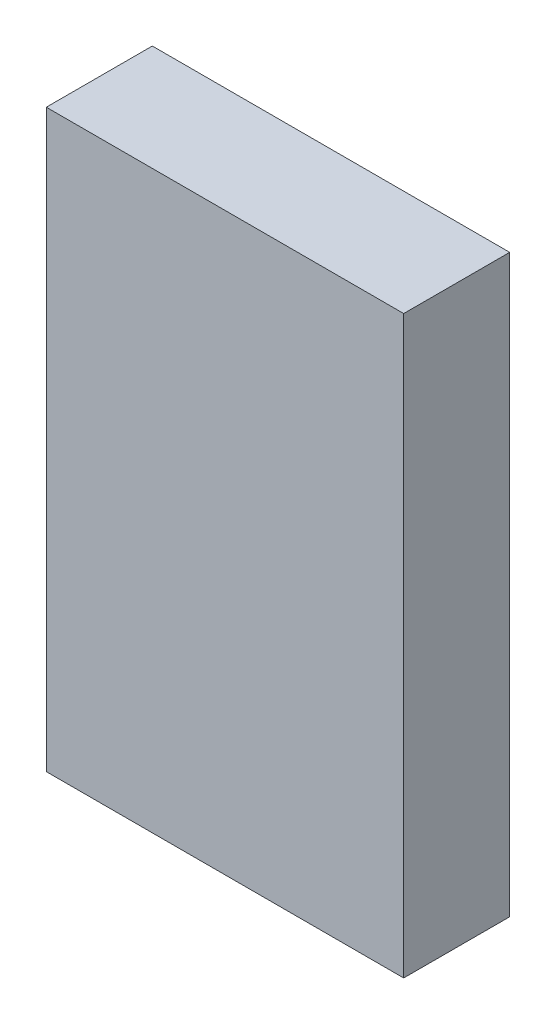
ISO-10303-21;
HEADER;
FILE_DESCRIPTION(('STEP AP214'),'2;1');
FILE_NAME('part.step','',(''),(''),'','','');
FILE_SCHEMA(('AUTOMOTIVE_DESIGN { 1 0 10303 214 1 1 1 1 }'));
ENDSEC;
DATA;
#1=APPLICATION_CONTEXT('core data for automotive mechanical design processes');
#2=APPLICATION_PROTOCOL_DEFINITION('international standard','automotive_design',2000,#1);
#3=PRODUCT_CONTEXT('',#1,'mechanical');
#4=PRODUCT('Part','Part','',(#3));
#5=PRODUCT_RELATED_PRODUCT_CATEGORY('part','',(#4));
#6=PRODUCT_DEFINITION_FORMATION('','',#4);
#7=PRODUCT_DEFINITION_CONTEXT('part definition',#1,'design');
#8=PRODUCT_DEFINITION('design','',#6,#7);
#9=PRODUCT_DEFINITION_SHAPE('','',#8);
#10=(LENGTH_UNIT() NAMED_UNIT(*) SI_UNIT(.MILLI.,.METRE.));
#11=(NAMED_UNIT(*) PLANE_ANGLE_UNIT() SI_UNIT($,.RADIAN.));
#12=(NAMED_UNIT(*) SI_UNIT($,.STERADIAN.) SOLID_ANGLE_UNIT());
#13=UNCERTAINTY_MEASURE_WITH_UNIT(LENGTH_MEASURE(1.E-05),#10,'distance_accuracy_value','');
#14=(GEOMETRIC_REPRESENTATION_CONTEXT(3) GLOBAL_UNCERTAINTY_ASSIGNED_CONTEXT((#13)) GLOBAL_UNIT_ASSIGNED_CONTEXT((#10,
#11,#12)) REPRESENTATION_CONTEXT('',''));
#15=CARTESIAN_POINT('',(0.,0.,0.));
#16=DIRECTION('',(0.,0.,1.));
#17=DIRECTION('',(1.,0.,0.));
#18=AXIS2_PLACEMENT_3D('',#15,#16,#17);
#19=CARTESIAN_POINT('',(-5.9,-9.5,1.75));
#20=DIRECTION('',(1.,0.,0.));
#21=DIRECTION('',(0.,0.,-1.));
#22=AXIS2_PLACEMENT_3D('',#19,#20,#21);
#23=PLANE('',#22);
#24=DIRECTION('',(0.,-1.,0.));
#25=VECTOR('',#24,1.);
#26=CARTESIAN_POINT('',(-5.9,-9.5,-1.75));
#27=LINE('',#26,#25);
#28=CARTESIAN_POINT('',(-5.9,9.5,-1.75));
#29=VERTEX_POINT('',#28);
#30=CARTESIAN_POINT('',(-5.9,-9.5,-1.75));
#31=VERTEX_POINT('',#30);
#32=EDGE_CURVE('E107',#29,#31,#27,.T.);
#33=ORIENTED_EDGE('',*,*,#32,.T.);
#34=DIRECTION('',(0.,0.,-1.));
#35=VECTOR('',#34,1.);
#36=CARTESIAN_POINT('',(-5.9,-9.5,1.75));
#37=LINE('',#36,#35);
#38=CARTESIAN_POINT('',(-5.9,-9.5,1.75));
#39=VERTEX_POINT('',#38);
#40=EDGE_CURVE('E11',#39,#31,#37,.T.);
#41=ORIENTED_EDGE('',*,*,#40,.F.);
#42=DIRECTION('',(0.,-1.,0.));
#43=VECTOR('',#42,1.);
#44=CARTESIAN_POINT('',(-5.9,-9.5,1.75));
#45=LINE('',#44,#43);
#46=CARTESIAN_POINT('',(-5.9,9.5,1.75));
#47=VERTEX_POINT('',#46);
#48=EDGE_CURVE('E91',#47,#39,#45,.T.);
#49=ORIENTED_EDGE('',*,*,#48,.F.);
#50=DIRECTION('',(0.,0.,-1.));
#51=VECTOR('',#50,1.);
#52=CARTESIAN_POINT('',(-5.9,9.5,1.75));
#53=LINE('',#52,#51);
#54=EDGE_CURVE('E103',#47,#29,#53,.T.);
#55=ORIENTED_EDGE('',*,*,#54,.T.);
#56=EDGE_LOOP('',(#33,#41,#49,#55));
#57=FACE_BOUND('',#56,.T.);
#58=ADVANCED_FACE('F39',(#57),#23,.F.);
#59=CARTESIAN_POINT('',(5.9,-9.5,1.75));
#60=DIRECTION('',(0.,1.,0.));
#61=DIRECTION('',(-1.,0.,0.));
#62=AXIS2_PLACEMENT_3D('',#59,#60,#61);
#63=PLANE('',#62);
#64=DIRECTION('',(1.,0.,0.));
#65=VECTOR('',#64,1.);
#66=CARTESIAN_POINT('',(5.9,-9.5,-1.75));
#67=LINE('',#66,#65);
#68=CARTESIAN_POINT('',(5.9,-9.5,-1.75));
#69=VERTEX_POINT('',#68);
#70=EDGE_CURVE('E96',#31,#69,#67,.T.);
#71=ORIENTED_EDGE('',*,*,#70,.T.);
#72=DIRECTION('',(0.,0.,-1.));
#73=VECTOR('',#72,1.);
#74=CARTESIAN_POINT('',(5.9,-9.5,1.75));
#75=LINE('',#74,#73);
#76=CARTESIAN_POINT('',(5.9,-9.5,1.75));
#77=VERTEX_POINT('',#76);
#78=EDGE_CURVE('E48',#77,#69,#75,.T.);
#79=ORIENTED_EDGE('',*,*,#78,.F.);
#80=DIRECTION('',(1.,0.,0.));
#81=VECTOR('',#80,1.);
#82=CARTESIAN_POINT('',(5.9,-9.5,1.75));
#83=LINE('',#82,#81);
#84=EDGE_CURVE('E86',#39,#77,#83,.T.);
#85=ORIENTED_EDGE('',*,*,#84,.F.);
#86=ORIENTED_EDGE('',*,*,#40,.T.);
#87=EDGE_LOOP('',(#71,#79,#85,#86));
#88=FACE_BOUND('',#87,.T.);
#89=ADVANCED_FACE('F95',(#88),#63,.F.);
#90=CARTESIAN_POINT('',(5.9,-9.5,1.75));
#91=DIRECTION('',(-1.,0.,0.));
#92=DIRECTION('',(0.,0.,1.));
#93=AXIS2_PLACEMENT_3D('',#90,#91,#92);
#94=PLANE('',#93);
#95=DIRECTION('',(0.,1.,0.));
#96=VECTOR('',#95,1.);
#97=CARTESIAN_POINT('',(5.9,-9.5,-1.75));
#98=LINE('',#97,#96);
#99=CARTESIAN_POINT('',(5.9,9.5,-1.75));
#100=VERTEX_POINT('',#99);
#101=EDGE_CURVE('E73',#69,#100,#98,.T.);
#102=ORIENTED_EDGE('',*,*,#101,.T.);
#103=DIRECTION('',(0.,0.,-1.));
#104=VECTOR('',#103,1.);
#105=CARTESIAN_POINT('',(5.9,9.5,1.75));
#106=LINE('',#105,#104);
#107=CARTESIAN_POINT('',(5.9,9.5,1.75));
#108=VERTEX_POINT('',#107);
#109=EDGE_CURVE('E98',#108,#100,#106,.T.);
#110=ORIENTED_EDGE('',*,*,#109,.F.);
#111=DIRECTION('',(0.,1.,0.));
#112=VECTOR('',#111,1.);
#113=CARTESIAN_POINT('',(5.9,-9.5,1.75));
#114=LINE('',#113,#112);
#115=EDGE_CURVE('E89',#77,#108,#114,.T.);
#116=ORIENTED_EDGE('',*,*,#115,.F.);
#117=ORIENTED_EDGE('',*,*,#78,.T.);
#118=EDGE_LOOP('',(#102,#110,#116,#117));
#119=FACE_BOUND('',#118,.T.);
#120=ADVANCED_FACE('F99',(#119),#94,.F.);
#121=CARTESIAN_POINT('',(5.9,9.5,1.75));
#122=DIRECTION('',(0.,-1.,0.));
#123=DIRECTION('',(1.,0.,0.));
#124=AXIS2_PLACEMENT_3D('',#121,#122,#123);
#125=PLANE('',#124);
#126=DIRECTION('',(-1.,0.,0.));
#127=VECTOR('',#126,1.);
#128=CARTESIAN_POINT('',(5.9,9.5,-1.75));
#129=LINE('',#128,#127);
#130=EDGE_CURVE('E79',#100,#29,#129,.T.);
#131=ORIENTED_EDGE('',*,*,#130,.T.);
#132=ORIENTED_EDGE('',*,*,#54,.F.);
#133=DIRECTION('',(-1.,0.,0.));
#134=VECTOR('',#133,1.);
#135=CARTESIAN_POINT('',(5.9,9.5,1.75));
#136=LINE('',#135,#134);
#137=EDGE_CURVE('E56',#108,#47,#136,.T.);
#138=ORIENTED_EDGE('',*,*,#137,.F.);
#139=ORIENTED_EDGE('',*,*,#109,.T.);
#140=EDGE_LOOP('',(#131,#132,#138,#139));
#141=FACE_BOUND('',#140,.T.);
#142=ADVANCED_FACE('F120',(#141),#125,.F.);
#143=CARTESIAN_POINT('',(0.,0.,1.75));
#144=DIRECTION('',(0.,0.,1.));
#145=DIRECTION('',(1.,0.,0.));
#146=AXIS2_PLACEMENT_3D('',#143,#144,#145);
#147=PLANE('',#146);
#148=ORIENTED_EDGE('',*,*,#48,.T.);
#149=ORIENTED_EDGE('',*,*,#84,.T.);
#150=ORIENTED_EDGE('',*,*,#115,.T.);
#151=ORIENTED_EDGE('',*,*,#137,.T.);
#152=EDGE_LOOP('',(#148,#149,#150,#151));
#153=FACE_BOUND('',#152,.T.);
#154=ADVANCED_FACE('F87',(#153),#147,.T.);
#155=CARTESIAN_POINT('',(0.,0.,-1.75));
#156=DIRECTION('',(0.,0.,1.));
#157=DIRECTION('',(1.,0.,0.));
#158=AXIS2_PLACEMENT_3D('',#155,#156,#157);
#159=PLANE('',#158);
#160=ORIENTED_EDGE('',*,*,#32,.F.);
#161=ORIENTED_EDGE('',*,*,#130,.F.);
#162=ORIENTED_EDGE('',*,*,#101,.F.);
#163=ORIENTED_EDGE('',*,*,#70,.F.);
#164=EDGE_LOOP('',(#160,#161,#162,#163));
#165=FACE_BOUND('',#164,.T.);
#166=ADVANCED_FACE('F123',(#165),#159,.F.);
#167=CLOSED_SHELL('',(#58,#89,#120,#142,#154,#166));
#168=MANIFOLD_SOLID_BREP('B2',#167);
#169=ADVANCED_BREP_SHAPE_REPRESENTATION('',(#18,#168),#14);
#170=SHAPE_DEFINITION_REPRESENTATION(#9,#169);
ENDSEC;
END-ISO-10303-21;
